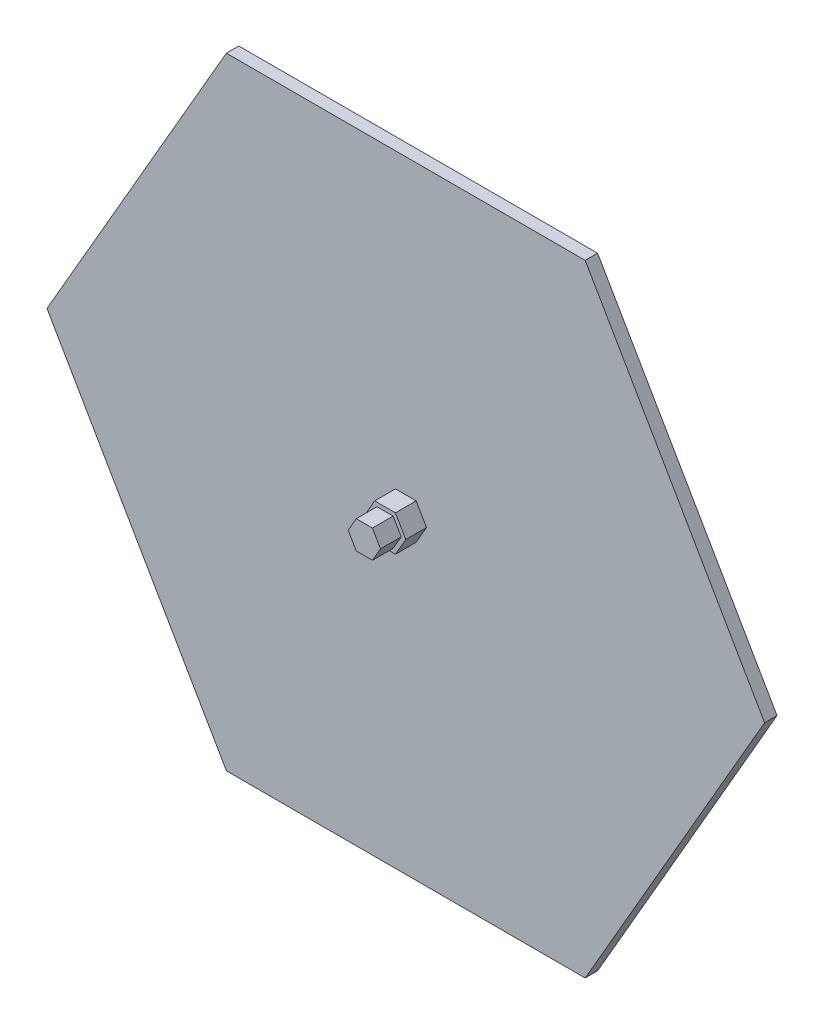
ISO-10303-21;
HEADER;
FILE_DESCRIPTION(('STEP AP214'),'2;1');
FILE_NAME('part.step','',(''),(''),'','','');
FILE_SCHEMA(('AUTOMOTIVE_DESIGN { 1 0 10303 214 1 1 1 1 }'));
ENDSEC;
DATA;
#1=APPLICATION_CONTEXT('core data for automotive mechanical design processes');
#2=APPLICATION_PROTOCOL_DEFINITION('international standard','automotive_design',2000,#1);
#3=PRODUCT_CONTEXT('',#1,'mechanical');
#4=PRODUCT('Part','Part','',(#3));
#5=PRODUCT_RELATED_PRODUCT_CATEGORY('part','',(#4));
#6=PRODUCT_DEFINITION_FORMATION('','',#4);
#7=PRODUCT_DEFINITION_CONTEXT('part definition',#1,'design');
#8=PRODUCT_DEFINITION('design','',#6,#7);
#9=PRODUCT_DEFINITION_SHAPE('','',#8);
#10=(LENGTH_UNIT() NAMED_UNIT(*) SI_UNIT(.MILLI.,.METRE.));
#11=(NAMED_UNIT(*) PLANE_ANGLE_UNIT() SI_UNIT($,.RADIAN.));
#12=(NAMED_UNIT(*) SI_UNIT($,.STERADIAN.) SOLID_ANGLE_UNIT());
#13=UNCERTAINTY_MEASURE_WITH_UNIT(LENGTH_MEASURE(1.E-05),#10,'distance_accuracy_value','');
#14=(GEOMETRIC_REPRESENTATION_CONTEXT(3) GLOBAL_UNCERTAINTY_ASSIGNED_CONTEXT((#13)) GLOBAL_UNIT_ASSIGNED_CONTEXT((#10,
#11,#12)) REPRESENTATION_CONTEXT('',''));
#15=CARTESIAN_POINT('',(0.,0.,0.));
#16=DIRECTION('',(0.,0.,1.));
#17=DIRECTION('',(1.,0.,0.));
#18=AXIS2_PLACEMENT_3D('',#15,#16,#17);
#19=CARTESIAN_POINT('',(0.,0.,8.00000037997961));
#20=DIRECTION('',(0.,0.,-1.));
#21=DIRECTION('',(-1.,0.,0.));
#22=AXIS2_PLACEMENT_3D('',#19,#20,#21);
#23=PLANE('',#22);
#24=DIRECTION('',(-0.500000637641352,-0.86602503564172,0.));
#25=VECTOR('',#24,1.);
#26=CARTESIAN_POINT('',(-5.00000268220901,0.,8.00000037997961));
#27=LINE('',#26,#25);
#28=CARTESIAN_POINT('',(-2.49999761581421,4.33012843132019,8.00000037997961));
#29=VERTEX_POINT('',#28);
#30=CARTESIAN_POINT('',(-5.00000268220901,0.,8.00000037997961));
#31=VERTEX_POINT('',#30);
#32=EDGE_CURVE('E200',#29,#31,#27,.T.);
#33=ORIENTED_EDGE('',*,*,#32,.T.);
#34=DIRECTION('',(0.500000637641352,-0.86602503564172,0.));
#35=VECTOR('',#34,1.);
#36=CARTESIAN_POINT('',(-2.49999761581421,-4.33012843132019,8.00000037997961));
#37=LINE('',#36,#35);
#38=CARTESIAN_POINT('',(-2.49999761581421,-4.33012843132019,8.00000037997961));
#39=VERTEX_POINT('',#38);
#40=EDGE_CURVE('E204',#31,#39,#37,.T.);
#41=ORIENTED_EDGE('',*,*,#40,.T.);
#42=DIRECTION('',(1.,0.,0.));
#43=VECTOR('',#42,1.);
#44=CARTESIAN_POINT('',(2.49999761581421,-4.33012843132019,8.00000037997961));
#45=LINE('',#44,#43);
#46=CARTESIAN_POINT('',(2.49999761581421,-4.33012843132019,8.00000037997961));
#47=VERTEX_POINT('',#46);
#48=EDGE_CURVE('E208',#39,#47,#45,.T.);
#49=ORIENTED_EDGE('',*,*,#48,.T.);
#50=DIRECTION('',(0.500000637641351,0.86602503564172,0.));
#51=VECTOR('',#50,1.);
#52=CARTESIAN_POINT('',(5.00000268220901,0.,8.00000037997961));
#53=LINE('',#52,#51);
#54=CARTESIAN_POINT('',(5.00000268220901,0.,8.00000037997961));
#55=VERTEX_POINT('',#54);
#56=EDGE_CURVE('E211',#47,#55,#53,.T.);
#57=ORIENTED_EDGE('',*,*,#56,.T.);
#58=DIRECTION('',(-0.500000637641352,0.86602503564172,0.));
#59=VECTOR('',#58,1.);
#60=CARTESIAN_POINT('',(2.49999761581421,4.33012843132019,8.00000037997961));
#61=LINE('',#60,#59);
#62=CARTESIAN_POINT('',(2.49999761581421,4.33012843132019,8.00000037997961));
#63=VERTEX_POINT('',#62);
#64=EDGE_CURVE('E214',#55,#63,#61,.T.);
#65=ORIENTED_EDGE('',*,*,#64,.T.);
#66=DIRECTION('',(-1.,0.,0.));
#67=VECTOR('',#66,1.);
#68=CARTESIAN_POINT('',(-2.49999761581421,4.33012843132019,8.00000037997961));
#69=LINE('',#68,#67);
#70=EDGE_CURVE('E217',#63,#29,#69,.T.);
#71=ORIENTED_EDGE('',*,*,#70,.T.);
#72=EDGE_LOOP('',(#33,#41,#49,#57,#65,#71));
#73=FACE_BOUND('',#72,.T.);
#74=DIRECTION('',(1.,0.,0.));
#75=VECTOR('',#74,1.);
#76=CARTESIAN_POINT('',(1.94999575614928,-3.37749719619754,8.00000037997961));
#77=LINE('',#76,#75);
#78=CARTESIAN_POINT('',(-1.94999575614932,-3.37749719619754,8.00000037997961));
#79=VERTEX_POINT('',#78);
#80=CARTESIAN_POINT('',(1.94999575614928,-3.37749719619754,8.00000037997961));
#81=VERTEX_POINT('',#80);
#82=EDGE_CURVE('E57',#79,#81,#77,.T.);
#83=ORIENTED_EDGE('',*,*,#82,.F.);
#84=DIRECTION('',(0.500000825253247,-0.86602492732373,0.));
#85=VECTOR('',#84,1.);
#86=CARTESIAN_POINT('',(-1.94999575614932,-3.37749719619754,8.00000037997961));
#87=LINE('',#86,#85);
#88=CARTESIAN_POINT('',(-3.89999896287919,0.,8.00000037997961));
#89=VERTEX_POINT('',#88);
#90=EDGE_CURVE('E61',#89,#79,#87,.T.);
#91=ORIENTED_EDGE('',*,*,#90,.F.);
#92=DIRECTION('',(-0.500000825253249,-0.866024927323729,0.));
#93=VECTOR('',#92,1.);
#94=CARTESIAN_POINT('',(-3.89999896287919,0.,8.00000037997961));
#95=LINE('',#94,#93);
#96=CARTESIAN_POINT('',(-1.94999575614931,3.37749719619748,8.00000037997961));
#97=VERTEX_POINT('',#96);
#98=EDGE_CURVE('E540',#97,#89,#95,.T.);
#99=ORIENTED_EDGE('',*,*,#98,.F.);
#100=DIRECTION('',(-1.,0.,0.));
#101=VECTOR('',#100,1.);
#102=CARTESIAN_POINT('',(-1.94999575614931,3.37749719619748,8.00000037997961));
#103=LINE('',#102,#101);
#104=CARTESIAN_POINT('',(1.94999575614929,3.37749719619748,8.00000037997961));
#105=VERTEX_POINT('',#104);
#106=EDGE_CURVE('E560',#105,#97,#103,.T.);
#107=ORIENTED_EDGE('',*,*,#106,.F.);
#108=DIRECTION('',(-0.500000825253244,0.866024927323732,0.));
#109=VECTOR('',#108,1.);
#110=CARTESIAN_POINT('',(1.94999575614929,3.37749719619748,8.00000037997961));
#111=LINE('',#110,#109);
#112=CARTESIAN_POINT('',(3.89999896287916,0.,8.00000037997961));
#113=VERTEX_POINT('',#112);
#114=EDGE_CURVE('E563',#113,#105,#111,.T.);
#115=ORIENTED_EDGE('',*,*,#114,.F.);
#116=DIRECTION('',(0.500000825253249,0.866024927323729,0.));
#117=VECTOR('',#116,1.);
#118=CARTESIAN_POINT('',(3.89999896287916,0.,8.00000037997961));
#119=LINE('',#118,#117);
#120=EDGE_CURVE('E565',#81,#113,#119,.T.);
#121=ORIENTED_EDGE('',*,*,#120,.F.);
#122=EDGE_LOOP('',(#83,#91,#99,#107,#115,#121));
#123=FACE_BOUND('',#122,.T.);
#124=ADVANCED_FACE('F39',(#73,#123),#23,.F.);
#125=CARTESIAN_POINT('',(0.,0.,3.00000002607703));
#126=DIRECTION('',(0.,0.,-1.));
#127=DIRECTION('',(-1.,0.,0.));
#128=AXIS2_PLACEMENT_3D('',#125,#126,#127);
#129=PLANE('',#128);
#130=DIRECTION('',(-0.499999978368253,0.866025416273533,0.));
#131=VECTOR('',#130,1.);
#132=CARTESIAN_POINT('',(-43.3012676914029,-75.,3.00000002607703));
#133=LINE('',#132,#131);
#134=CARTESIAN_POINT('',(-43.3012676914029,-75.,3.00000002607703));
#135=VERTEX_POINT('',#134);
#136=CARTESIAN_POINT('',(-86.6025353828059,0.,3.00000002607703));
#137=VERTEX_POINT('',#136);
#138=EDGE_CURVE('E263',#135,#137,#133,.T.);
#139=ORIENTED_EDGE('',*,*,#138,.F.);
#140=DIRECTION('',(-1.,0.,0.));
#141=VECTOR('',#140,1.);
#142=CARTESIAN_POINT('',(43.3012676914028,-75.,3.00000002607703));
#143=LINE('',#142,#141);
#144=CARTESIAN_POINT('',(43.3012676914028,-75.,3.00000002607703));
#145=VERTEX_POINT('',#144);
#146=EDGE_CURVE('E284',#145,#135,#143,.T.);
#147=ORIENTED_EDGE('',*,*,#146,.F.);
#148=DIRECTION('',(-0.499999978368253,-0.866025416273533,0.));
#149=VECTOR('',#148,1.);
#150=CARTESIAN_POINT('',(86.6025353828059,0.,3.00000002607703));
#151=LINE('',#150,#149);
#152=CARTESIAN_POINT('',(86.6025353828059,0.,3.00000002607703));
#153=VERTEX_POINT('',#152);
#154=EDGE_CURVE('E280',#153,#145,#151,.T.);
#155=ORIENTED_EDGE('',*,*,#154,.F.);
#156=DIRECTION('',(0.499999978368252,-0.866025416273534,0.));
#157=VECTOR('',#156,1.);
#158=CARTESIAN_POINT('',(43.301267691403,75.,3.00000002607703));
#159=LINE('',#158,#157);
#160=CARTESIAN_POINT('',(43.301267691403,75.,3.00000002607703));
#161=VERTEX_POINT('',#160);
#162=EDGE_CURVE('E276',#161,#153,#159,.T.);
#163=ORIENTED_EDGE('',*,*,#162,.F.);
#164=DIRECTION('',(1.,0.,0.));
#165=VECTOR('',#164,1.);
#166=CARTESIAN_POINT('',(-43.301267691403,75.,3.00000002607703));
#167=LINE('',#166,#165);
#168=CARTESIAN_POINT('',(-43.301267691403,75.,3.00000002607703));
#169=VERTEX_POINT('',#168);
#170=EDGE_CURVE('E272',#169,#161,#167,.T.);
#171=ORIENTED_EDGE('',*,*,#170,.F.);
#172=DIRECTION('',(0.499999978368252,0.866025416273534,0.));
#173=VECTOR('',#172,1.);
#174=CARTESIAN_POINT('',(-86.6025353828059,0.,3.00000002607703));
#175=LINE('',#174,#173);
#176=EDGE_CURVE('E267',#137,#169,#175,.T.);
#177=ORIENTED_EDGE('',*,*,#176,.F.);
#178=EDGE_LOOP('',(#139,#147,#155,#163,#171,#177));
#179=FACE_BOUND('',#178,.T.);
#180=DIRECTION('',(-0.500000637641352,-0.86602503564172,0.));
#181=VECTOR('',#180,1.);
#182=CARTESIAN_POINT('',(-5.00000268220901,0.,3.00000002607703));
#183=LINE('',#182,#181);
#184=CARTESIAN_POINT('',(-2.49999761581421,4.33012843132019,3.00000002607703));
#185=VERTEX_POINT('',#184);
#186=CARTESIAN_POINT('',(-5.00000268220902,0.,3.00000002607703));
#187=VERTEX_POINT('',#186);
#188=EDGE_CURVE('E189',#185,#187,#183,.T.);
#189=ORIENTED_EDGE('',*,*,#188,.F.);
#190=DIRECTION('',(-1.,0.,0.));
#191=VECTOR('',#190,1.);
#192=CARTESIAN_POINT('',(-2.49999761581421,4.33012843132019,3.00000002607703));
#193=LINE('',#192,#191);
#194=CARTESIAN_POINT('',(2.49999761581421,4.33012843132019,3.00000002607703));
#195=VERTEX_POINT('',#194);
#196=EDGE_CURVE('E205',#195,#185,#193,.T.);
#197=ORIENTED_EDGE('',*,*,#196,.F.);
#198=DIRECTION('',(-0.500000637641352,0.86602503564172,0.));
#199=VECTOR('',#198,1.);
#200=CARTESIAN_POINT('',(2.49999761581421,4.33012843132019,3.00000002607703));
#201=LINE('',#200,#199);
#202=CARTESIAN_POINT('',(5.00000268220901,0.,3.00000002607703));
#203=VERTEX_POINT('',#202);
#204=EDGE_CURVE('E232',#203,#195,#201,.T.);
#205=ORIENTED_EDGE('',*,*,#204,.F.);
#206=DIRECTION('',(0.500000637641351,0.86602503564172,0.));
#207=VECTOR('',#206,1.);
#208=CARTESIAN_POINT('',(5.00000268220901,0.,3.00000002607703));
#209=LINE('',#208,#207);
#210=CARTESIAN_POINT('',(2.49999761581421,-4.33012843132019,3.00000002607703));
#211=VERTEX_POINT('',#210);
#212=EDGE_CURVE('E228',#211,#203,#209,.T.);
#213=ORIENTED_EDGE('',*,*,#212,.F.);
#214=DIRECTION('',(1.,0.,0.));
#215=VECTOR('',#214,1.);
#216=CARTESIAN_POINT('',(2.49999761581421,-4.33012843132019,3.00000002607703));
#217=LINE('',#216,#215);
#218=CARTESIAN_POINT('',(-2.49999761581421,-4.33012843132019,3.00000002607703));
#219=VERTEX_POINT('',#218);
#220=EDGE_CURVE('E224',#219,#211,#217,.T.);
#221=ORIENTED_EDGE('',*,*,#220,.F.);
#222=DIRECTION('',(0.500000637641352,-0.86602503564172,0.));
#223=VECTOR('',#222,1.);
#224=CARTESIAN_POINT('',(-2.49999761581421,-4.33012843132019,3.00000002607703));
#225=LINE('',#224,#223);
#226=EDGE_CURVE('E194',#187,#219,#225,.T.);
#227=ORIENTED_EDGE('',*,*,#226,.F.);
#228=EDGE_LOOP('',(#189,#197,#205,#213,#221,#227));
#229=FACE_BOUND('',#228,.T.);
#230=ADVANCED_FACE('F336',(#179,#229),#129,.F.);
#231=CARTESIAN_POINT('',(-43.3012676914029,-75.,3.00000002607703));
#232=DIRECTION('',(-0.866025416273533,-0.499999978368253,0.));
#233=DIRECTION('',(0.499999978368253,-0.866025416273533,0.));
#234=AXIS2_PLACEMENT_3D('',#231,#232,#233);
#235=PLANE('',#234);
#236=DIRECTION('',(-0.499999978368253,0.866025416273533,0.));
#237=VECTOR('',#236,1.);
#238=CARTESIAN_POINT('',(-43.3012676914029,-75.,0.));
#239=LINE('',#238,#237);
#240=CARTESIAN_POINT('',(-43.3012676914029,-75.,0.));
#241=VERTEX_POINT('',#240);
#242=CARTESIAN_POINT('',(-86.6025353828059,0.,0.));
#243=VERTEX_POINT('',#242);
#244=EDGE_CURVE('E262',#241,#243,#239,.T.);
#245=ORIENTED_EDGE('',*,*,#244,.F.);
#246=DIRECTION('',(0.,0.,-1.));
#247=VECTOR('',#246,1.);
#248=CARTESIAN_POINT('',(-43.3012676914029,-75.,3.00000002607703));
#249=LINE('',#248,#247);
#250=EDGE_CURVE('E11',#135,#241,#249,.T.);
#251=ORIENTED_EDGE('',*,*,#250,.F.);
#252=ORIENTED_EDGE('',*,*,#138,.T.);
#253=DIRECTION('',(0.,0.,-1.));
#254=VECTOR('',#253,1.);
#255=CARTESIAN_POINT('',(-86.6025353828059,0.,3.00000002607703));
#256=LINE('',#255,#254);
#257=EDGE_CURVE('E43',#137,#243,#256,.T.);
#258=ORIENTED_EDGE('',*,*,#257,.T.);
#259=EDGE_LOOP('',(#245,#251,#252,#258));
#260=FACE_BOUND('',#259,.T.);
#261=ADVANCED_FACE('F41',(#260),#235,.T.);
#262=CARTESIAN_POINT('',(43.3012676914028,-75.,3.00000002607703));
#263=DIRECTION('',(0.,-1.,0.));
#264=DIRECTION('',(1.,0.,0.));
#265=AXIS2_PLACEMENT_3D('',#262,#263,#264);
#266=PLANE('',#265);
#267=DIRECTION('',(-1.,0.,0.));
#268=VECTOR('',#267,1.);
#269=CARTESIAN_POINT('',(43.3012676914028,-75.,0.));
#270=LINE('',#269,#268);
#271=CARTESIAN_POINT('',(43.3012676914028,-75.,0.));
#272=VERTEX_POINT('',#271);
#273=EDGE_CURVE('E268',#272,#241,#270,.T.);
#274=ORIENTED_EDGE('',*,*,#273,.F.);
#275=DIRECTION('',(0.,0.,-1.));
#276=VECTOR('',#275,1.);
#277=CARTESIAN_POINT('',(43.3012676914028,-75.,3.00000002607703));
#278=LINE('',#277,#276);
#279=EDGE_CURVE('E49',#145,#272,#278,.T.);
#280=ORIENTED_EDGE('',*,*,#279,.F.);
#281=ORIENTED_EDGE('',*,*,#146,.T.);
#282=ORIENTED_EDGE('',*,*,#250,.T.);
#283=EDGE_LOOP('',(#274,#280,#281,#282));
#284=FACE_BOUND('',#283,.T.);
#285=ADVANCED_FACE('F333',(#284),#266,.T.);
#286=CARTESIAN_POINT('',(86.6025353828059,0.,3.00000002607703));
#287=DIRECTION('',(0.866025416273533,-0.499999978368253,0.));
#288=DIRECTION('',(0.499999978368253,0.866025416273533,0.));
#289=AXIS2_PLACEMENT_3D('',#286,#287,#288);
#290=PLANE('',#289);
#291=DIRECTION('',(-0.499999978368253,-0.866025416273533,0.));
#292=VECTOR('',#291,1.);
#293=CARTESIAN_POINT('',(86.6025353828059,0.,0.));
#294=LINE('',#293,#292);
#295=CARTESIAN_POINT('',(86.6025353828059,0.,0.));
#296=VERTEX_POINT('',#295);
#297=EDGE_CURVE('E303',#296,#272,#294,.T.);
#298=ORIENTED_EDGE('',*,*,#297,.F.);
#299=DIRECTION('',(0.,0.,-1.));
#300=VECTOR('',#299,1.);
#301=CARTESIAN_POINT('',(86.6025353828059,0.,3.00000002607703));
#302=LINE('',#301,#300);
#303=EDGE_CURVE('E312',#153,#296,#302,.T.);
#304=ORIENTED_EDGE('',*,*,#303,.F.);
#305=ORIENTED_EDGE('',*,*,#154,.T.);
#306=ORIENTED_EDGE('',*,*,#279,.T.);
#307=EDGE_LOOP('',(#298,#304,#305,#306));
#308=FACE_BOUND('',#307,.T.);
#309=ADVANCED_FACE('F347',(#308),#290,.T.);
#310=CARTESIAN_POINT('',(43.301267691403,75.,3.00000002607703));
#311=DIRECTION('',(0.866025416273534,0.499999978368252,0.));
#312=DIRECTION('',(-0.499999978368252,0.866025416273534,0.));
#313=AXIS2_PLACEMENT_3D('',#310,#311,#312);
#314=PLANE('',#313);
#315=DIRECTION('',(0.499999978368252,-0.866025416273534,0.));
#316=VECTOR('',#315,1.);
#317=CARTESIAN_POINT('',(43.301267691403,75.,0.));
#318=LINE('',#317,#316);
#319=CARTESIAN_POINT('',(43.301267691403,75.,0.));
#320=VERTEX_POINT('',#319);
#321=EDGE_CURVE('E299',#320,#296,#318,.T.);
#322=ORIENTED_EDGE('',*,*,#321,.F.);
#323=DIRECTION('',(0.,0.,-1.));
#324=VECTOR('',#323,1.);
#325=CARTESIAN_POINT('',(43.301267691403,75.,3.00000002607703));
#326=LINE('',#325,#324);
#327=EDGE_CURVE('E315',#161,#320,#326,.T.);
#328=ORIENTED_EDGE('',*,*,#327,.F.);
#329=ORIENTED_EDGE('',*,*,#162,.T.);
#330=ORIENTED_EDGE('',*,*,#303,.T.);
#331=EDGE_LOOP('',(#322,#328,#329,#330));
#332=FACE_BOUND('',#331,.T.);
#333=ADVANCED_FACE('F345',(#332),#314,.T.);
#334=CARTESIAN_POINT('',(-43.301267691403,75.,3.00000002607703));
#335=DIRECTION('',(0.,1.,0.));
#336=DIRECTION('',(0.,0.,1.));
#337=AXIS2_PLACEMENT_3D('',#334,#335,#336);
#338=PLANE('',#337);
#339=DIRECTION('',(1.,0.,0.));
#340=VECTOR('',#339,1.);
#341=CARTESIAN_POINT('',(-43.301267691403,75.,0.));
#342=LINE('',#341,#340);
#343=CARTESIAN_POINT('',(-43.301267691403,75.,0.));
#344=VERTEX_POINT('',#343);
#345=EDGE_CURVE('E295',#344,#320,#342,.T.);
#346=ORIENTED_EDGE('',*,*,#345,.F.);
#347=DIRECTION('',(0.,0.,-1.));
#348=VECTOR('',#347,1.);
#349=CARTESIAN_POINT('',(-43.301267691403,75.,3.00000002607703));
#350=LINE('',#349,#348);
#351=EDGE_CURVE('E317',#169,#344,#350,.T.);
#352=ORIENTED_EDGE('',*,*,#351,.F.);
#353=ORIENTED_EDGE('',*,*,#170,.T.);
#354=ORIENTED_EDGE('',*,*,#327,.T.);
#355=EDGE_LOOP('',(#346,#352,#353,#354));
#356=FACE_BOUND('',#355,.T.);
#357=ADVANCED_FACE('F342',(#356),#338,.T.);
#358=CARTESIAN_POINT('',(-86.6025353828059,0.,3.00000002607703));
#359=DIRECTION('',(-0.866025416273534,0.499999978368252,0.));
#360=DIRECTION('',(-0.499999978368252,-0.866025416273534,0.));
#361=AXIS2_PLACEMENT_3D('',#358,#359,#360);
#362=PLANE('',#361);
#363=DIRECTION('',(0.499999978368252,0.866025416273534,0.));
#364=VECTOR('',#363,1.);
#365=CARTESIAN_POINT('',(-86.6025353828059,0.,0.));
#366=LINE('',#365,#364);
#367=EDGE_CURVE('E291',#243,#344,#366,.T.);
#368=ORIENTED_EDGE('',*,*,#367,.F.);
#369=ORIENTED_EDGE('',*,*,#257,.F.);
#370=ORIENTED_EDGE('',*,*,#176,.T.);
#371=ORIENTED_EDGE('',*,*,#351,.T.);
#372=EDGE_LOOP('',(#368,#369,#370,#371));
#373=FACE_BOUND('',#372,.T.);
#374=ADVANCED_FACE('F327',(#373),#362,.T.);
#375=CARTESIAN_POINT('',(0.,0.,0.));
#376=DIRECTION('',(0.,0.,-1.));
#377=DIRECTION('',(-1.,0.,0.));
#378=AXIS2_PLACEMENT_3D('',#375,#376,#377);
#379=PLANE('',#378);
#380=ORIENTED_EDGE('',*,*,#244,.T.);
#381=ORIENTED_EDGE('',*,*,#367,.T.);
#382=ORIENTED_EDGE('',*,*,#345,.T.);
#383=ORIENTED_EDGE('',*,*,#321,.T.);
#384=ORIENTED_EDGE('',*,*,#297,.T.);
#385=ORIENTED_EDGE('',*,*,#273,.T.);
#386=EDGE_LOOP('',(#380,#381,#382,#383,#384,#385));
#387=FACE_BOUND('',#386,.T.);
#388=ADVANCED_FACE('F329',(#387),#379,.T.);
#389=CARTESIAN_POINT('',(-5.00000268220901,0.,8.00000037997961));
#390=DIRECTION('',(0.86602503564172,-0.500000637641352,0.));
#391=DIRECTION('',(0.500000637641352,0.86602503564172,0.));
#392=AXIS2_PLACEMENT_3D('',#389,#390,#391);
#393=PLANE('',#392);
#394=ORIENTED_EDGE('',*,*,#188,.T.);
#395=DIRECTION('',(0.,0.,-1.));
#396=VECTOR('',#395,1.);
#397=CARTESIAN_POINT('',(-5.00000268220901,0.,8.00000037997961));
#398=LINE('',#397,#396);
#399=EDGE_CURVE('E258',#31,#187,#398,.T.);
#400=ORIENTED_EDGE('',*,*,#399,.F.);
#401=ORIENTED_EDGE('',*,*,#32,.F.);
#402=DIRECTION('',(0.,0.,-1.));
#403=VECTOR('',#402,1.);
#404=CARTESIAN_POINT('',(-2.49999761581421,4.33012843132019,8.00000037997961));
#405=LINE('',#404,#403);
#406=EDGE_CURVE('E219',#29,#185,#405,.T.);
#407=ORIENTED_EDGE('',*,*,#406,.T.);
#408=EDGE_LOOP('',(#394,#400,#401,#407));
#409=FACE_BOUND('',#408,.T.);
#410=ADVANCED_FACE('F385',(#409),#393,.F.);
#411=CARTESIAN_POINT('',(-2.49999761581421,-4.33012843132019,8.00000037997961));
#412=DIRECTION('',(0.86602503564172,0.500000637641352,0.));
#413=DIRECTION('',(-0.500000637641352,0.86602503564172,0.));
#414=AXIS2_PLACEMENT_3D('',#411,#412,#413);
#415=PLANE('',#414);
#416=ORIENTED_EDGE('',*,*,#226,.T.);
#417=DIRECTION('',(0.,0.,-1.));
#418=VECTOR('',#417,1.);
#419=CARTESIAN_POINT('',(-2.49999761581421,-4.33012843132019,8.00000037997961));
#420=LINE('',#419,#418);
#421=EDGE_CURVE('E254',#39,#219,#420,.T.);
#422=ORIENTED_EDGE('',*,*,#421,.F.);
#423=ORIENTED_EDGE('',*,*,#40,.F.);
#424=ORIENTED_EDGE('',*,*,#399,.T.);
#425=EDGE_LOOP('',(#416,#422,#423,#424));
#426=FACE_BOUND('',#425,.T.);
#427=ADVANCED_FACE('F381',(#426),#415,.F.);
#428=CARTESIAN_POINT('',(2.49999761581421,-4.33012843132019,8.00000037997961));
#429=DIRECTION('',(0.,1.,0.));
#430=DIRECTION('',(0.,0.,1.));
#431=AXIS2_PLACEMENT_3D('',#428,#429,#430);
#432=PLANE('',#431);
#433=ORIENTED_EDGE('',*,*,#220,.T.);
#434=DIRECTION('',(0.,0.,-1.));
#435=VECTOR('',#434,1.);
#436=CARTESIAN_POINT('',(2.49999761581421,-4.33012843132019,8.00000037997961));
#437=LINE('',#436,#435);
#438=EDGE_CURVE('E250',#47,#211,#437,.T.);
#439=ORIENTED_EDGE('',*,*,#438,.F.);
#440=ORIENTED_EDGE('',*,*,#48,.F.);
#441=ORIENTED_EDGE('',*,*,#421,.T.);
#442=EDGE_LOOP('',(#433,#439,#440,#441));
#443=FACE_BOUND('',#442,.T.);
#444=ADVANCED_FACE('F377',(#443),#432,.F.);
#445=CARTESIAN_POINT('',(5.00000268220901,0.,8.00000037997961));
#446=DIRECTION('',(-0.86602503564172,0.500000637641351,0.));
#447=DIRECTION('',(-0.500000637641351,-0.86602503564172,0.));
#448=AXIS2_PLACEMENT_3D('',#445,#446,#447);
#449=PLANE('',#448);
#450=ORIENTED_EDGE('',*,*,#212,.T.);
#451=DIRECTION('',(0.,0.,-1.));
#452=VECTOR('',#451,1.);
#453=CARTESIAN_POINT('',(5.00000268220901,0.,8.00000037997961));
#454=LINE('',#453,#452);
#455=EDGE_CURVE('E246',#55,#203,#454,.T.);
#456=ORIENTED_EDGE('',*,*,#455,.F.);
#457=ORIENTED_EDGE('',*,*,#56,.F.);
#458=ORIENTED_EDGE('',*,*,#438,.T.);
#459=EDGE_LOOP('',(#450,#456,#457,#458));
#460=FACE_BOUND('',#459,.T.);
#461=ADVANCED_FACE('F373',(#460),#449,.F.);
#462=CARTESIAN_POINT('',(2.49999761581421,4.33012843132019,8.00000037997961));
#463=DIRECTION('',(-0.86602503564172,-0.500000637641352,0.));
#464=DIRECTION('',(0.500000637641352,-0.86602503564172,0.));
#465=AXIS2_PLACEMENT_3D('',#462,#463,#464);
#466=PLANE('',#465);
#467=ORIENTED_EDGE('',*,*,#204,.T.);
#468=DIRECTION('',(0.,0.,-1.));
#469=VECTOR('',#468,1.);
#470=CARTESIAN_POINT('',(2.49999761581421,4.33012843132019,8.00000037997961));
#471=LINE('',#470,#469);
#472=EDGE_CURVE('E242',#63,#195,#471,.T.);
#473=ORIENTED_EDGE('',*,*,#472,.F.);
#474=ORIENTED_EDGE('',*,*,#64,.F.);
#475=ORIENTED_EDGE('',*,*,#455,.T.);
#476=EDGE_LOOP('',(#467,#473,#474,#475));
#477=FACE_BOUND('',#476,.T.);
#478=ADVANCED_FACE('F369',(#477),#466,.F.);
#479=CARTESIAN_POINT('',(-2.49999761581421,4.33012843132019,8.00000037997961));
#480=DIRECTION('',(0.,-1.,0.));
#481=DIRECTION('',(0.,0.,-1.));
#482=AXIS2_PLACEMENT_3D('',#479,#480,#481);
#483=PLANE('',#482);
#484=ORIENTED_EDGE('',*,*,#196,.T.);
#485=ORIENTED_EDGE('',*,*,#406,.F.);
#486=ORIENTED_EDGE('',*,*,#70,.F.);
#487=ORIENTED_EDGE('',*,*,#472,.T.);
#488=EDGE_LOOP('',(#484,#485,#486,#487));
#489=FACE_BOUND('',#488,.T.);
#490=ADVANCED_FACE('F366',(#489),#483,.F.);
#491=CARTESIAN_POINT('',(1.94999575614928,-3.37749719619754,13.0000002682209));
#492=DIRECTION('',(0.,1.,0.));
#493=DIRECTION('',(-1.,0.,0.));
#494=AXIS2_PLACEMENT_3D('',#491,#492,#493);
#495=PLANE('',#494);
#496=ORIENTED_EDGE('',*,*,#82,.T.);
#497=DIRECTION('',(0.,0.,-1.));
#498=VECTOR('',#497,1.);
#499=CARTESIAN_POINT('',(1.94999575614928,-3.37749719619754,13.0000002682209));
#500=LINE('',#499,#498);
#501=CARTESIAN_POINT('',(1.94999575614928,-3.37749719619754,13.0000002682209));
#502=VERTEX_POINT('',#501);
#503=EDGE_CURVE('E169',#502,#81,#500,.T.);
#504=ORIENTED_EDGE('',*,*,#503,.F.);
#505=DIRECTION('',(1.,0.,0.));
#506=VECTOR('',#505,1.);
#507=CARTESIAN_POINT('',(1.94999575614928,-3.37749719619754,13.0000002682209));
#508=LINE('',#507,#506);
#509=CARTESIAN_POINT('',(-1.94999575614932,-3.37749719619754,13.0000002682209));
#510=VERTEX_POINT('',#509);
#511=EDGE_CURVE('E176',#510,#502,#508,.T.);
#512=ORIENTED_EDGE('',*,*,#511,.F.);
#513=DIRECTION('',(0.,0.,-1.));
#514=VECTOR('',#513,1.);
#515=CARTESIAN_POINT('',(-1.94999575614932,-3.37749719619754,13.0000002682209));
#516=LINE('',#515,#514);
#517=EDGE_CURVE('E536',#510,#79,#516,.T.);
#518=ORIENTED_EDGE('',*,*,#517,.T.);
#519=EDGE_LOOP('',(#496,#504,#512,#518));
#520=FACE_BOUND('',#519,.T.);
#521=ADVANCED_FACE('F187',(#520),#495,.F.);
#522=CARTESIAN_POINT('',(3.89999896287916,0.,13.0000002682209));
#523=DIRECTION('',(-0.866024927323729,0.500000825253249,0.));
#524=DIRECTION('',(-0.500000825253249,-0.866024927323729,0.));
#525=AXIS2_PLACEMENT_3D('',#522,#523,#524);
#526=PLANE('',#525);
#527=ORIENTED_EDGE('',*,*,#120,.T.);
#528=DIRECTION('',(0.,0.,-1.));
#529=VECTOR('',#528,1.);
#530=CARTESIAN_POINT('',(3.89999896287916,0.,13.0000002682209));
#531=LINE('',#530,#529);
#532=CARTESIAN_POINT('',(3.89999896287916,0.,13.0000002682209));
#533=VERTEX_POINT('',#532);
#534=EDGE_CURVE('E171',#533,#113,#531,.T.);
#535=ORIENTED_EDGE('',*,*,#534,.F.);
#536=DIRECTION('',(0.500000825253249,0.866024927323729,0.));
#537=VECTOR('',#536,1.);
#538=CARTESIAN_POINT('',(3.89999896287916,0.,13.0000002682209));
#539=LINE('',#538,#537);
#540=EDGE_CURVE('E164',#502,#533,#539,.T.);
#541=ORIENTED_EDGE('',*,*,#540,.F.);
#542=ORIENTED_EDGE('',*,*,#503,.T.);
#543=EDGE_LOOP('',(#527,#535,#541,#542));
#544=FACE_BOUND('',#543,.T.);
#545=ADVANCED_FACE('F167',(#544),#526,.F.);
#546=CARTESIAN_POINT('',(1.94999575614929,3.37749719619748,13.0000002682209));
#547=DIRECTION('',(-0.866024927323732,-0.500000825253244,0.));
#548=DIRECTION('',(0.500000825253244,-0.866024927323732,0.));
#549=AXIS2_PLACEMENT_3D('',#546,#547,#548);
#550=PLANE('',#549);
#551=ORIENTED_EDGE('',*,*,#114,.T.);
#552=DIRECTION('',(0.,0.,-1.));
#553=VECTOR('',#552,1.);
#554=CARTESIAN_POINT('',(1.94999575614929,3.37749719619748,13.0000002682209));
#555=LINE('',#554,#553);
#556=CARTESIAN_POINT('',(1.94999575614929,3.37749719619748,13.0000002682209));
#557=VERTEX_POINT('',#556);
#558=EDGE_CURVE('E196',#557,#105,#555,.T.);
#559=ORIENTED_EDGE('',*,*,#558,.F.);
#560=DIRECTION('',(-0.500000825253244,0.866024927323732,0.));
#561=VECTOR('',#560,1.);
#562=CARTESIAN_POINT('',(1.94999575614929,3.37749719619748,13.0000002682209));
#563=LINE('',#562,#561);
#564=EDGE_CURVE('E175',#533,#557,#563,.T.);
#565=ORIENTED_EDGE('',*,*,#564,.F.);
#566=ORIENTED_EDGE('',*,*,#534,.T.);
#567=EDGE_LOOP('',(#551,#559,#565,#566));
#568=FACE_BOUND('',#567,.T.);
#569=ADVANCED_FACE('F485',(#568),#550,.F.);
#570=CARTESIAN_POINT('',(-1.94999575614931,3.37749719619748,13.0000002682209));
#571=DIRECTION('',(0.,-1.,0.));
#572=DIRECTION('',(0.,0.,-1.));
#573=AXIS2_PLACEMENT_3D('',#570,#571,#572);
#574=PLANE('',#573);
#575=ORIENTED_EDGE('',*,*,#106,.T.);
#576=DIRECTION('',(0.,0.,-1.));
#577=VECTOR('',#576,1.);
#578=CARTESIAN_POINT('',(-1.94999575614931,3.37749719619748,13.0000002682209));
#579=LINE('',#578,#577);
#580=CARTESIAN_POINT('',(-1.94999575614931,3.37749719619748,13.0000002682209));
#581=VERTEX_POINT('',#580);
#582=EDGE_CURVE('E546',#581,#97,#579,.T.);
#583=ORIENTED_EDGE('',*,*,#582,.F.);
#584=DIRECTION('',(-1.,0.,0.));
#585=VECTOR('',#584,1.);
#586=CARTESIAN_POINT('',(-1.94999575614931,3.37749719619748,13.0000002682209));
#587=LINE('',#586,#585);
#588=EDGE_CURVE('E561',#557,#581,#587,.T.);
#589=ORIENTED_EDGE('',*,*,#588,.F.);
#590=ORIENTED_EDGE('',*,*,#558,.T.);
#591=EDGE_LOOP('',(#575,#583,#589,#590));
#592=FACE_BOUND('',#591,.T.);
#593=ADVANCED_FACE('F493',(#592),#574,.F.);
#594=CARTESIAN_POINT('',(-3.89999896287919,0.,13.0000002682209));
#595=DIRECTION('',(0.866024927323729,-0.500000825253249,0.));
#596=DIRECTION('',(0.500000825253249,0.866024927323729,0.));
#597=AXIS2_PLACEMENT_3D('',#594,#595,#596);
#598=PLANE('',#597);
#599=ORIENTED_EDGE('',*,*,#98,.T.);
#600=DIRECTION('',(0.,0.,-1.));
#601=VECTOR('',#600,1.);
#602=CARTESIAN_POINT('',(-3.89999896287919,0.,13.0000002682209));
#603=LINE('',#602,#601);
#604=CARTESIAN_POINT('',(-3.89999896287919,0.,13.0000002682209));
#605=VERTEX_POINT('',#604);
#606=EDGE_CURVE('E538',#605,#89,#603,.T.);
#607=ORIENTED_EDGE('',*,*,#606,.F.);
#608=DIRECTION('',(-0.500000825253249,-0.866024927323729,0.));
#609=VECTOR('',#608,1.);
#610=CARTESIAN_POINT('',(-3.89999896287919,0.,13.0000002682209));
#611=LINE('',#610,#609);
#612=EDGE_CURVE('E548',#581,#605,#611,.T.);
#613=ORIENTED_EDGE('',*,*,#612,.F.);
#614=ORIENTED_EDGE('',*,*,#582,.T.);
#615=EDGE_LOOP('',(#599,#607,#613,#614));
#616=FACE_BOUND('',#615,.T.);
#617=ADVANCED_FACE('F503',(#616),#598,.F.);
#618=CARTESIAN_POINT('',(-1.94999575614932,-3.37749719619754,13.0000002682209));
#619=DIRECTION('',(0.86602492732373,0.500000825253247,0.));
#620=DIRECTION('',(-0.500000825253247,0.86602492732373,0.));
#621=AXIS2_PLACEMENT_3D('',#618,#619,#620);
#622=PLANE('',#621);
#623=ORIENTED_EDGE('',*,*,#90,.T.);
#624=ORIENTED_EDGE('',*,*,#517,.F.);
#625=DIRECTION('',(0.500000825253247,-0.86602492732373,0.));
#626=VECTOR('',#625,1.);
#627=CARTESIAN_POINT('',(-1.94999575614932,-3.37749719619754,13.0000002682209));
#628=LINE('',#627,#626);
#629=EDGE_CURVE('E181',#605,#510,#628,.T.);
#630=ORIENTED_EDGE('',*,*,#629,.F.);
#631=ORIENTED_EDGE('',*,*,#606,.T.);
#632=EDGE_LOOP('',(#623,#624,#630,#631));
#633=FACE_BOUND('',#632,.T.);
#634=ADVANCED_FACE('F513',(#633),#622,.F.);
#635=CARTESIAN_POINT('',(0.,0.,13.0000002682209));
#636=DIRECTION('',(0.,0.,-1.));
#637=DIRECTION('',(-1.,0.,0.));
#638=AXIS2_PLACEMENT_3D('',#635,#636,#637);
#639=PLANE('',#638);
#640=ORIENTED_EDGE('',*,*,#511,.T.);
#641=ORIENTED_EDGE('',*,*,#540,.T.);
#642=ORIENTED_EDGE('',*,*,#564,.T.);
#643=ORIENTED_EDGE('',*,*,#588,.T.);
#644=ORIENTED_EDGE('',*,*,#612,.T.);
#645=ORIENTED_EDGE('',*,*,#629,.T.);
#646=EDGE_LOOP('',(#640,#641,#642,#643,#644,#645));
#647=FACE_BOUND('',#646,.T.);
#648=ADVANCED_FACE('F179',(#647),#639,.F.);
#649=CLOSED_SHELL('',(#124,#230,#261,#285,#309,#333,#357,#374,#388,#410,#427,#444,#461,#478,
#490,#521,#545,#569,#593,#617,#634,#648));
#650=MANIFOLD_SOLID_BREP('B2',#649);
#651=ADVANCED_BREP_SHAPE_REPRESENTATION('',(#18,#650),#14);
#652=SHAPE_DEFINITION_REPRESENTATION(#9,#651);
ENDSEC;
END-ISO-10303-21;
